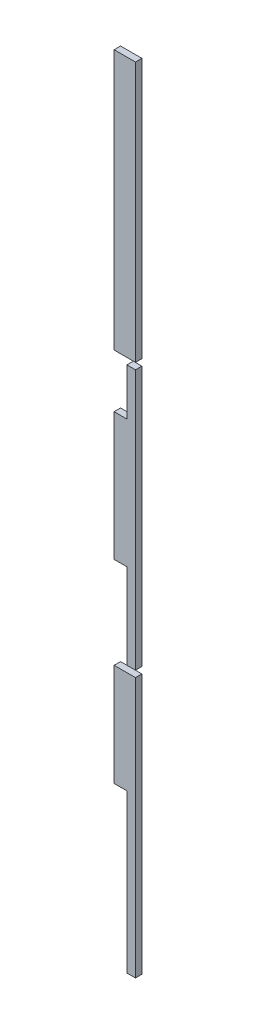
ISO-10303-21;
HEADER;
FILE_DESCRIPTION(('STEP AP214'),'2;1');
FILE_NAME('part.step','',(''),(''),'','','');
FILE_SCHEMA(('AUTOMOTIVE_DESIGN { 1 0 10303 214 1 1 1 1 }'));
ENDSEC;
DATA;
#1=APPLICATION_CONTEXT('core data for automotive mechanical design processes');
#2=APPLICATION_PROTOCOL_DEFINITION('international standard','automotive_design',2000,#1);
#3=PRODUCT_CONTEXT('',#1,'mechanical');
#4=PRODUCT('Part','Part','',(#3));
#5=PRODUCT_RELATED_PRODUCT_CATEGORY('part','',(#4));
#6=PRODUCT_DEFINITION_FORMATION('','',#4);
#7=PRODUCT_DEFINITION_CONTEXT('part definition',#1,'design');
#8=PRODUCT_DEFINITION('design','',#6,#7);
#9=PRODUCT_DEFINITION_SHAPE('','',#8);
#10=(LENGTH_UNIT() NAMED_UNIT(*) SI_UNIT(.MILLI.,.METRE.));
#11=(NAMED_UNIT(*) PLANE_ANGLE_UNIT() SI_UNIT($,.RADIAN.));
#12=(NAMED_UNIT(*) SI_UNIT($,.STERADIAN.) SOLID_ANGLE_UNIT());
#13=UNCERTAINTY_MEASURE_WITH_UNIT(LENGTH_MEASURE(1.E-05),#10,'distance_accuracy_value','');
#14=(GEOMETRIC_REPRESENTATION_CONTEXT(3) GLOBAL_UNCERTAINTY_ASSIGNED_CONTEXT((#13)) GLOBAL_UNIT_ASSIGNED_CONTEXT((#10,
#11,#12)) REPRESENTATION_CONTEXT('',''));
#15=CARTESIAN_POINT('',(0.,0.,0.));
#16=DIRECTION('',(0.,0.,1.));
#17=DIRECTION('',(1.,0.,0.));
#18=AXIS2_PLACEMENT_3D('',#15,#16,#17);
#19=CARTESIAN_POINT('',(126.787596037725,-1066.01,3.));
#20=DIRECTION('',(1.,0.,0.));
#21=DIRECTION('',(0.,0.,-1.));
#22=AXIS2_PLACEMENT_3D('',#19,#20,#21);
#23=PLANE('',#22);
#24=DIRECTION('',(0.,-1.,0.));
#25=VECTOR('',#24,1.);
#26=CARTESIAN_POINT('',(126.787596037725,-1066.01,0.));
#27=LINE('',#26,#25);
#28=CARTESIAN_POINT('',(126.787596037725,-1066.01,0.));
#29=VERTEX_POINT('',#28);
#30=CARTESIAN_POINT('',(126.787596037725,-1140.01,0.));
#31=VERTEX_POINT('',#30);
#32=EDGE_CURVE('E12',#29,#31,#27,.T.);
#33=ORIENTED_EDGE('',*,*,#32,.T.);
#34=DIRECTION('',(0.,0.,-1.));
#35=VECTOR('',#34,1.);
#36=CARTESIAN_POINT('',(126.787596037725,-1140.01,3.));
#37=LINE('',#36,#35);
#38=CARTESIAN_POINT('',(126.787596037725,-1140.01,3.));
#39=VERTEX_POINT('',#38);
#40=EDGE_CURVE('E154',#39,#31,#37,.T.);
#41=ORIENTED_EDGE('',*,*,#40,.F.);
#42=DIRECTION('',(0.,-1.,0.));
#43=VECTOR('',#42,1.);
#44=CARTESIAN_POINT('',(126.787596037725,-1066.01,3.));
#45=LINE('',#44,#43);
#46=CARTESIAN_POINT('',(126.787596037725,-1066.01,3.));
#47=VERTEX_POINT('',#46);
#48=EDGE_CURVE('E56',#47,#39,#45,.T.);
#49=ORIENTED_EDGE('',*,*,#48,.F.);
#50=DIRECTION('',(0.,0.,-1.));
#51=VECTOR('',#50,1.);
#52=CARTESIAN_POINT('',(126.787596037725,-1066.01,3.));
#53=LINE('',#52,#51);
#54=EDGE_CURVE('E142',#47,#29,#53,.T.);
#55=ORIENTED_EDGE('',*,*,#54,.T.);
#56=EDGE_LOOP('',(#33,#41,#49,#55));
#57=FACE_BOUND('',#56,.T.);
#58=ADVANCED_FACE('F52',(#57),#23,.F.);
#59=CARTESIAN_POINT('',(130.787596037725,-1140.01,3.));
#60=DIRECTION('',(0.,1.,0.));
#61=DIRECTION('',(0.,0.,1.));
#62=AXIS2_PLACEMENT_3D('',#59,#60,#61);
#63=PLANE('',#62);
#64=DIRECTION('',(1.,0.,0.));
#65=VECTOR('',#64,1.);
#66=CARTESIAN_POINT('',(130.787596037725,-1140.01,0.));
#67=LINE('',#66,#65);
#68=CARTESIAN_POINT('',(130.787596037725,-1140.01,0.));
#69=VERTEX_POINT('',#68);
#70=EDGE_CURVE('E62',#31,#69,#67,.T.);
#71=ORIENTED_EDGE('',*,*,#70,.T.);
#72=DIRECTION('',(0.,0.,-1.));
#73=VECTOR('',#72,1.);
#74=CARTESIAN_POINT('',(130.787596037725,-1140.01,3.));
#75=LINE('',#74,#73);
#76=CARTESIAN_POINT('',(130.787596037725,-1140.01,3.));
#77=VERTEX_POINT('',#76);
#78=EDGE_CURVE('E120',#77,#69,#75,.T.);
#79=ORIENTED_EDGE('',*,*,#78,.F.);
#80=DIRECTION('',(1.,0.,0.));
#81=VECTOR('',#80,1.);
#82=CARTESIAN_POINT('',(130.787596037725,-1140.01,3.));
#83=LINE('',#82,#81);
#84=EDGE_CURVE('E92',#39,#77,#83,.T.);
#85=ORIENTED_EDGE('',*,*,#84,.F.);
#86=ORIENTED_EDGE('',*,*,#40,.T.);
#87=EDGE_LOOP('',(#71,#79,#85,#86));
#88=FACE_BOUND('',#87,.T.);
#89=ADVANCED_FACE('F155',(#88),#63,.F.);
#90=CARTESIAN_POINT('',(130.787596037725,-1018.01,3.));
#91=DIRECTION('',(-1.,0.,0.));
#92=DIRECTION('',(0.,0.,1.));
#93=AXIS2_PLACEMENT_3D('',#90,#91,#92);
#94=PLANE('',#93);
#95=DIRECTION('',(0.,1.,0.));
#96=VECTOR('',#95,1.);
#97=CARTESIAN_POINT('',(130.787596037725,-1018.01,0.));
#98=LINE('',#97,#96);
#99=CARTESIAN_POINT('',(130.787596037725,-1018.01,0.));
#100=VERTEX_POINT('',#99);
#101=EDGE_CURVE('E114',#69,#100,#98,.T.);
#102=ORIENTED_EDGE('',*,*,#101,.T.);
#103=DIRECTION('',(0.,0.,-1.));
#104=VECTOR('',#103,1.);
#105=CARTESIAN_POINT('',(130.787596037725,-1018.01,3.));
#106=LINE('',#105,#104);
#107=CARTESIAN_POINT('',(130.787596037725,-1018.01,3.));
#108=VERTEX_POINT('',#107);
#109=EDGE_CURVE('E118',#108,#100,#106,.T.);
#110=ORIENTED_EDGE('',*,*,#109,.F.);
#111=DIRECTION('',(0.,1.,0.));
#112=VECTOR('',#111,1.);
#113=CARTESIAN_POINT('',(130.787596037725,-1076.01,3.));
#114=LINE('',#113,#112);
#115=EDGE_CURVE('E145',#77,#108,#114,.T.);
#116=ORIENTED_EDGE('',*,*,#115,.F.);
#117=ORIENTED_EDGE('',*,*,#78,.T.);
#118=EDGE_LOOP('',(#102,#110,#116,#117));
#119=FACE_BOUND('',#118,.T.);
#120=ADVANCED_FACE('F116',(#119),#94,.F.);
#121=CARTESIAN_POINT('',(120.787596037725,-1018.01,3.));
#122=DIRECTION('',(0.,-1.,0.));
#123=DIRECTION('',(0.,0.,-1.));
#124=AXIS2_PLACEMENT_3D('',#121,#122,#123);
#125=PLANE('',#124);
#126=DIRECTION('',(-1.,0.,0.));
#127=VECTOR('',#126,1.);
#128=CARTESIAN_POINT('',(120.787596037725,-1018.01,0.));
#129=LINE('',#128,#127);
#130=CARTESIAN_POINT('',(120.787596037725,-1018.01,0.));
#131=VERTEX_POINT('',#130);
#132=EDGE_CURVE('E122',#100,#131,#129,.T.);
#133=ORIENTED_EDGE('',*,*,#132,.T.);
#134=DIRECTION('',(0.,0.,-1.));
#135=VECTOR('',#134,1.);
#136=CARTESIAN_POINT('',(120.787596037725,-1018.01,3.));
#137=LINE('',#136,#135);
#138=CARTESIAN_POINT('',(120.787596037725,-1018.01,3.));
#139=VERTEX_POINT('',#138);
#140=EDGE_CURVE('E129',#139,#131,#137,.T.);
#141=ORIENTED_EDGE('',*,*,#140,.F.);
#142=DIRECTION('',(-1.,0.,0.));
#143=VECTOR('',#142,1.);
#144=CARTESIAN_POINT('',(120.787596037725,-1018.01,3.));
#145=LINE('',#144,#143);
#146=EDGE_CURVE('E128',#108,#139,#145,.T.);
#147=ORIENTED_EDGE('',*,*,#146,.F.);
#148=ORIENTED_EDGE('',*,*,#109,.T.);
#149=EDGE_LOOP('',(#133,#141,#147,#148));
#150=FACE_BOUND('',#149,.T.);
#151=ADVANCED_FACE('F125',(#150),#125,.F.);
#152=CARTESIAN_POINT('',(120.787596037725,-1018.01,3.));
#153=DIRECTION('',(1.,0.,0.));
#154=DIRECTION('',(0.,1.,0.));
#155=AXIS2_PLACEMENT_3D('',#152,#153,#154);
#156=PLANE('',#155);
#157=DIRECTION('',(0.,-1.,0.));
#158=VECTOR('',#157,1.);
#159=CARTESIAN_POINT('',(120.787596037725,-1018.01,0.));
#160=LINE('',#159,#158);
#161=CARTESIAN_POINT('',(120.787596037725,-1066.01,0.));
#162=VERTEX_POINT('',#161);
#163=EDGE_CURVE('E133',#131,#162,#160,.T.);
#164=ORIENTED_EDGE('',*,*,#163,.T.);
#165=DIRECTION('',(0.,0.,-1.));
#166=VECTOR('',#165,1.);
#167=CARTESIAN_POINT('',(120.787596037725,-1066.01,3.));
#168=LINE('',#167,#166);
#169=CARTESIAN_POINT('',(120.787596037725,-1066.01,3.));
#170=VERTEX_POINT('',#169);
#171=EDGE_CURVE('E150',#170,#162,#168,.T.);
#172=ORIENTED_EDGE('',*,*,#171,.F.);
#173=DIRECTION('',(0.,-1.,0.));
#174=VECTOR('',#173,1.);
#175=CARTESIAN_POINT('',(120.787596037725,-1018.01,3.));
#176=LINE('',#175,#174);
#177=EDGE_CURVE('E141',#139,#170,#176,.T.);
#178=ORIENTED_EDGE('',*,*,#177,.F.);
#179=ORIENTED_EDGE('',*,*,#140,.T.);
#180=EDGE_LOOP('',(#164,#172,#178,#179));
#181=FACE_BOUND('',#180,.T.);
#182=ADVANCED_FACE('F162',(#181),#156,.F.);
#183=CARTESIAN_POINT('',(120.787596037725,-1066.01,3.));
#184=DIRECTION('',(0.,1.,0.));
#185=DIRECTION('',(0.,0.,1.));
#186=AXIS2_PLACEMENT_3D('',#183,#184,#185);
#187=PLANE('',#186);
#188=DIRECTION('',(1.,0.,0.));
#189=VECTOR('',#188,1.);
#190=CARTESIAN_POINT('',(120.787596037725,-1066.01,0.));
#191=LINE('',#190,#189);
#192=EDGE_CURVE('E103',#162,#29,#191,.T.);
#193=ORIENTED_EDGE('',*,*,#192,.T.);
#194=ORIENTED_EDGE('',*,*,#54,.F.);
#195=DIRECTION('',(1.,0.,0.));
#196=VECTOR('',#195,1.);
#197=CARTESIAN_POINT('',(120.787596037725,-1066.01,3.));
#198=LINE('',#197,#196);
#199=EDGE_CURVE('E139',#170,#47,#198,.T.);
#200=ORIENTED_EDGE('',*,*,#199,.F.);
#201=ORIENTED_EDGE('',*,*,#171,.T.);
#202=EDGE_LOOP('',(#193,#194,#200,#201));
#203=FACE_BOUND('',#202,.T.);
#204=ADVANCED_FACE('F158',(#203),#187,.F.);
#205=CARTESIAN_POINT('',(0.,0.,3.));
#206=DIRECTION('',(0.,0.,-1.));
#207=DIRECTION('',(-1.,0.,0.));
#208=AXIS2_PLACEMENT_3D('',#205,#206,#207);
#209=PLANE('',#208);
#210=ORIENTED_EDGE('',*,*,#48,.T.);
#211=ORIENTED_EDGE('',*,*,#84,.T.);
#212=ORIENTED_EDGE('',*,*,#115,.T.);
#213=ORIENTED_EDGE('',*,*,#146,.T.);
#214=ORIENTED_EDGE('',*,*,#177,.T.);
#215=ORIENTED_EDGE('',*,*,#199,.T.);
#216=EDGE_LOOP('',(#210,#211,#212,#213,#214,#215));
#217=FACE_BOUND('',#216,.T.);
#218=ADVANCED_FACE('F54',(#217),#209,.F.);
#219=CARTESIAN_POINT('',(0.,0.,0.));
#220=DIRECTION('',(0.,0.,-1.));
#221=DIRECTION('',(-1.,0.,0.));
#222=AXIS2_PLACEMENT_3D('',#219,#220,#221);
#223=PLANE('',#222);
#224=ORIENTED_EDGE('',*,*,#32,.F.);
#225=ORIENTED_EDGE('',*,*,#192,.F.);
#226=ORIENTED_EDGE('',*,*,#163,.F.);
#227=ORIENTED_EDGE('',*,*,#132,.F.);
#228=ORIENTED_EDGE('',*,*,#101,.F.);
#229=ORIENTED_EDGE('',*,*,#70,.F.);
#230=EDGE_LOOP('',(#224,#225,#226,#227,#228,#229));
#231=FACE_BOUND('',#230,.T.);
#232=ADVANCED_FACE('F132',(#231),#223,.T.);
#233=CLOSED_SHELL('',(#58,#89,#120,#151,#182,#204,#218,#232));
#234=MANIFOLD_SOLID_BREP('B2',#233);
#235=CARTESIAN_POINT('',(120.787596037725,-975.01,3.));
#236=DIRECTION('',(1.,0.,0.));
#237=DIRECTION('',(0.,0.,-1.));
#238=AXIS2_PLACEMENT_3D('',#235,#236,#237);
#239=PLANE('',#238);
#240=DIRECTION('',(0.,-1.,0.));
#241=VECTOR('',#240,1.);
#242=CARTESIAN_POINT('',(120.787596037725,-975.01,0.));
#243=LINE('',#242,#241);
#244=CARTESIAN_POINT('',(120.787596037725,-915.01,0.));
#245=VERTEX_POINT('',#244);
#246=CARTESIAN_POINT('',(120.787596037725,-975.01,0.));
#247=VERTEX_POINT('',#246);
#248=EDGE_CURVE('E50',#245,#247,#243,.T.);
#249=ORIENTED_EDGE('',*,*,#248,.T.);
#250=DIRECTION('',(0.,0.,-1.));
#251=VECTOR('',#250,1.);
#252=CARTESIAN_POINT('',(120.787596037725,-975.01,3.));
#253=LINE('',#252,#251);
#254=CARTESIAN_POINT('',(120.787596037725,-975.01,3.));
#255=VERTEX_POINT('',#254);
#256=EDGE_CURVE('E376',#255,#247,#253,.T.);
#257=ORIENTED_EDGE('',*,*,#256,.F.);
#258=DIRECTION('',(0.,-1.,0.));
#259=VECTOR('',#258,1.);
#260=CARTESIAN_POINT('',(120.787596037725,-975.01,3.));
#261=LINE('',#260,#259);
#262=CARTESIAN_POINT('',(120.787596037725,-915.01,3.));
#263=VERTEX_POINT('',#262);
#264=EDGE_CURVE('E244',#263,#255,#261,.T.);
#265=ORIENTED_EDGE('',*,*,#264,.F.);
#266=DIRECTION('',(0.,0.,-1.));
#267=VECTOR('',#266,1.);
#268=CARTESIAN_POINT('',(120.787596037725,-915.01,3.));
#269=LINE('',#268,#267);
#270=EDGE_CURVE('E344',#263,#245,#269,.T.);
#271=ORIENTED_EDGE('',*,*,#270,.T.);
#272=EDGE_LOOP('',(#249,#257,#265,#271));
#273=FACE_BOUND('',#272,.T.);
#274=ADVANCED_FACE('F240',(#273),#239,.F.);
#275=CARTESIAN_POINT('',(120.787596037725,-975.01,3.));
#276=DIRECTION('',(0.,1.,0.));
#277=DIRECTION('',(0.,0.,1.));
#278=AXIS2_PLACEMENT_3D('',#275,#276,#277);
#279=PLANE('',#278);
#280=DIRECTION('',(1.,0.,0.));
#281=VECTOR('',#280,1.);
#282=CARTESIAN_POINT('',(120.787596037725,-975.01,0.));
#283=LINE('',#282,#281);
#284=CARTESIAN_POINT('',(126.787596037725,-975.01,0.));
#285=VERTEX_POINT('',#284);
#286=EDGE_CURVE('E250',#247,#285,#283,.T.);
#287=ORIENTED_EDGE('',*,*,#286,.T.);
#288=DIRECTION('',(0.,0.,-1.));
#289=VECTOR('',#288,1.);
#290=CARTESIAN_POINT('',(126.787596037725,-975.01,3.));
#291=LINE('',#290,#289);
#292=CARTESIAN_POINT('',(126.787596037725,-975.01,3.));
#293=VERTEX_POINT('',#292);
#294=EDGE_CURVE('E320',#293,#285,#291,.T.);
#295=ORIENTED_EDGE('',*,*,#294,.F.);
#296=DIRECTION('',(1.,0.,0.));
#297=VECTOR('',#296,1.);
#298=CARTESIAN_POINT('',(120.787596037725,-975.01,3.));
#299=LINE('',#298,#297);
#300=EDGE_CURVE('E286',#255,#293,#299,.T.);
#301=ORIENTED_EDGE('',*,*,#300,.F.);
#302=ORIENTED_EDGE('',*,*,#256,.T.);
#303=EDGE_LOOP('',(#287,#295,#301,#302));
#304=FACE_BOUND('',#303,.T.);
#305=ADVANCED_FACE('F382',(#304),#279,.F.);
#306=CARTESIAN_POINT('',(126.787596037725,-975.01,3.));
#307=DIRECTION('',(1.,0.,0.));
#308=DIRECTION('',(0.,1.,0.));
#309=AXIS2_PLACEMENT_3D('',#306,#307,#308);
#310=PLANE('',#309);
#311=DIRECTION('',(0.,-1.,0.));
#312=VECTOR('',#311,1.);
#313=CARTESIAN_POINT('',(126.787596037725,-975.01,0.));
#314=LINE('',#313,#312);
#315=CARTESIAN_POINT('',(126.787596037725,-1015.01,0.));
#316=VERTEX_POINT('',#315);
#317=EDGE_CURVE('E314',#285,#316,#314,.T.);
#318=ORIENTED_EDGE('',*,*,#317,.T.);
#319=DIRECTION('',(0.,0.,-1.));
#320=VECTOR('',#319,1.);
#321=CARTESIAN_POINT('',(126.787596037725,-1015.01,3.));
#322=LINE('',#321,#320);
#323=CARTESIAN_POINT('',(126.787596037725,-1015.01,3.));
#324=VERTEX_POINT('',#323);
#325=EDGE_CURVE('E318',#324,#316,#322,.T.);
#326=ORIENTED_EDGE('',*,*,#325,.F.);
#327=DIRECTION('',(0.,-1.,0.));
#328=VECTOR('',#327,1.);
#329=CARTESIAN_POINT('',(126.787596037725,-975.01,3.));
#330=LINE('',#329,#328);
#331=EDGE_CURVE('E351',#293,#324,#330,.T.);
#332=ORIENTED_EDGE('',*,*,#331,.F.);
#333=ORIENTED_EDGE('',*,*,#294,.T.);
#334=EDGE_LOOP('',(#318,#326,#332,#333));
#335=FACE_BOUND('',#334,.T.);
#336=ADVANCED_FACE('F316',(#335),#310,.F.);
#337=CARTESIAN_POINT('',(130.787596037725,-1015.01,3.));
#338=DIRECTION('',(0.,1.,0.));
#339=DIRECTION('',(0.,0.,1.));
#340=AXIS2_PLACEMENT_3D('',#337,#338,#339);
#341=PLANE('',#340);
#342=DIRECTION('',(1.,0.,0.));
#343=VECTOR('',#342,1.);
#344=CARTESIAN_POINT('',(130.787596037725,-1015.01,0.));
#345=LINE('',#344,#343);
#346=CARTESIAN_POINT('',(130.787596037725,-1015.01,0.));
#347=VERTEX_POINT('',#346);
#348=EDGE_CURVE('E322',#316,#347,#345,.T.);
#349=ORIENTED_EDGE('',*,*,#348,.T.);
#350=DIRECTION('',(0.,0.,-1.));
#351=VECTOR('',#350,1.);
#352=CARTESIAN_POINT('',(130.787596037725,-1015.01,3.));
#353=LINE('',#352,#351);
#354=CARTESIAN_POINT('',(130.787596037725,-1015.01,3.));
#355=VERTEX_POINT('',#354);
#356=EDGE_CURVE('E330',#355,#347,#353,.T.);
#357=ORIENTED_EDGE('',*,*,#356,.F.);
#358=DIRECTION('',(1.,0.,0.));
#359=VECTOR('',#358,1.);
#360=CARTESIAN_POINT('',(130.787596037725,-1015.01,3.));
#361=LINE('',#360,#359);
#362=EDGE_CURVE('E329',#324,#355,#361,.T.);
#363=ORIENTED_EDGE('',*,*,#362,.F.);
#364=ORIENTED_EDGE('',*,*,#325,.T.);
#365=EDGE_LOOP('',(#349,#357,#363,#364));
#366=FACE_BOUND('',#365,.T.);
#367=ADVANCED_FACE('F326',(#366),#341,.F.);
#368=CARTESIAN_POINT('',(130.787596037725,-893.01,3.));
#369=DIRECTION('',(-1.,0.,0.));
#370=DIRECTION('',(0.,0.,1.));
#371=AXIS2_PLACEMENT_3D('',#368,#369,#370);
#372=PLANE('',#371);
#373=DIRECTION('',(0.,1.,0.));
#374=VECTOR('',#373,1.);
#375=CARTESIAN_POINT('',(130.787596037725,-893.01,0.));
#376=LINE('',#375,#374);
#377=CARTESIAN_POINT('',(130.787596037725,-893.01,0.));
#378=VERTEX_POINT('',#377);
#379=EDGE_CURVE('E334',#347,#378,#376,.T.);
#380=ORIENTED_EDGE('',*,*,#379,.T.);
#381=DIRECTION('',(0.,0.,-1.));
#382=VECTOR('',#381,1.);
#383=CARTESIAN_POINT('',(130.787596037725,-893.01,3.));
#384=LINE('',#383,#382);
#385=CARTESIAN_POINT('',(130.787596037725,-893.01,3.));
#386=VERTEX_POINT('',#385);
#387=EDGE_CURVE('E368',#386,#378,#384,.T.);
#388=ORIENTED_EDGE('',*,*,#387,.F.);
#389=DIRECTION('',(0.,1.,0.));
#390=VECTOR('',#389,1.);
#391=CARTESIAN_POINT('',(130.787596037725,-985.01,3.));
#392=LINE('',#391,#390);
#393=EDGE_CURVE('E348',#355,#386,#392,.T.);
#394=ORIENTED_EDGE('',*,*,#393,.F.);
#395=ORIENTED_EDGE('',*,*,#356,.T.);
#396=EDGE_LOOP('',(#380,#388,#394,#395));
#397=FACE_BOUND('',#396,.T.);
#398=ADVANCED_FACE('F385',(#397),#372,.F.);
#399=CARTESIAN_POINT('',(130.787596037725,-893.01,3.));
#400=DIRECTION('',(0.,-1.,0.));
#401=DIRECTION('',(0.,0.,-1.));
#402=AXIS2_PLACEMENT_3D('',#399,#400,#401);
#403=PLANE('',#402);
#404=DIRECTION('',(-1.,0.,0.));
#405=VECTOR('',#404,1.);
#406=CARTESIAN_POINT('',(130.787596037725,-893.01,0.));
#407=LINE('',#406,#405);
#408=CARTESIAN_POINT('',(126.787596037725,-893.01,0.));
#409=VERTEX_POINT('',#408);
#410=EDGE_CURVE('E336',#378,#409,#407,.T.);
#411=ORIENTED_EDGE('',*,*,#410,.T.);
#412=DIRECTION('',(0.,0.,-1.));
#413=VECTOR('',#412,1.);
#414=CARTESIAN_POINT('',(126.787596037725,-893.01,3.));
#415=LINE('',#414,#413);
#416=CARTESIAN_POINT('',(126.787596037725,-893.01,3.));
#417=VERTEX_POINT('',#416);
#418=EDGE_CURVE('E365',#417,#409,#415,.T.);
#419=ORIENTED_EDGE('',*,*,#418,.F.);
#420=DIRECTION('',(-1.,0.,0.));
#421=VECTOR('',#420,1.);
#422=CARTESIAN_POINT('',(130.787596037725,-893.01,3.));
#423=LINE('',#422,#421);
#424=EDGE_CURVE('E346',#386,#417,#423,.T.);
#425=ORIENTED_EDGE('',*,*,#424,.F.);
#426=ORIENTED_EDGE('',*,*,#387,.T.);
#427=EDGE_LOOP('',(#411,#419,#425,#426));
#428=FACE_BOUND('',#427,.T.);
#429=ADVANCED_FACE('F363',(#428),#403,.F.);
#430=CARTESIAN_POINT('',(126.787596037725,-893.01,3.));
#431=DIRECTION('',(1.,0.,0.));
#432=DIRECTION('',(0.,0.,-1.));
#433=AXIS2_PLACEMENT_3D('',#430,#431,#432);
#434=PLANE('',#433);
#435=DIRECTION('',(0.,-1.,0.));
#436=VECTOR('',#435,1.);
#437=CARTESIAN_POINT('',(126.787596037725,-893.01,0.));
#438=LINE('',#437,#436);
#439=CARTESIAN_POINT('',(126.787596037725,-915.01,0.));
#440=VERTEX_POINT('',#439);
#441=EDGE_CURVE('E354',#409,#440,#438,.T.);
#442=ORIENTED_EDGE('',*,*,#441,.T.);
#443=DIRECTION('',(0.,0.,-1.));
#444=VECTOR('',#443,1.);
#445=CARTESIAN_POINT('',(126.787596037725,-915.01,3.));
#446=LINE('',#445,#444);
#447=CARTESIAN_POINT('',(126.787596037725,-915.01,3.));
#448=VERTEX_POINT('',#447);
#449=EDGE_CURVE('E373',#448,#440,#446,.T.);
#450=ORIENTED_EDGE('',*,*,#449,.F.);
#451=DIRECTION('',(0.,-1.,0.));
#452=VECTOR('',#451,1.);
#453=CARTESIAN_POINT('',(126.787596037725,-893.01,3.));
#454=LINE('',#453,#452);
#455=EDGE_CURVE('E343',#417,#448,#454,.T.);
#456=ORIENTED_EDGE('',*,*,#455,.F.);
#457=ORIENTED_EDGE('',*,*,#418,.T.);
#458=EDGE_LOOP('',(#442,#450,#456,#457));
#459=FACE_BOUND('',#458,.T.);
#460=ADVANCED_FACE('F371',(#459),#434,.F.);
#461=CARTESIAN_POINT('',(120.787596037725,-915.01,3.));
#462=DIRECTION('',(0.,-1.,0.));
#463=DIRECTION('',(0.,0.,-1.));
#464=AXIS2_PLACEMENT_3D('',#461,#462,#463);
#465=PLANE('',#464);
#466=DIRECTION('',(-1.,0.,0.));
#467=VECTOR('',#466,1.);
#468=CARTESIAN_POINT('',(120.787596037725,-915.01,0.));
#469=LINE('',#468,#467);
#470=EDGE_CURVE('E297',#440,#245,#469,.T.);
#471=ORIENTED_EDGE('',*,*,#470,.T.);
#472=ORIENTED_EDGE('',*,*,#270,.F.);
#473=DIRECTION('',(-1.,0.,0.));
#474=VECTOR('',#473,1.);
#475=CARTESIAN_POINT('',(120.787596037725,-915.01,3.));
#476=LINE('',#475,#474);
#477=EDGE_CURVE('E341',#448,#263,#476,.T.);
#478=ORIENTED_EDGE('',*,*,#477,.F.);
#479=ORIENTED_EDGE('',*,*,#449,.T.);
#480=EDGE_LOOP('',(#471,#472,#478,#479));
#481=FACE_BOUND('',#480,.T.);
#482=ADVANCED_FACE('F386',(#481),#465,.F.);
#483=CARTESIAN_POINT('',(0.,0.,3.));
#484=DIRECTION('',(0.,0.,-1.));
#485=DIRECTION('',(-1.,0.,0.));
#486=AXIS2_PLACEMENT_3D('',#483,#484,#485);
#487=PLANE('',#486);
#488=ORIENTED_EDGE('',*,*,#264,.T.);
#489=ORIENTED_EDGE('',*,*,#300,.T.);
#490=ORIENTED_EDGE('',*,*,#331,.T.);
#491=ORIENTED_EDGE('',*,*,#362,.T.);
#492=ORIENTED_EDGE('',*,*,#393,.T.);
#493=ORIENTED_EDGE('',*,*,#424,.T.);
#494=ORIENTED_EDGE('',*,*,#455,.T.);
#495=ORIENTED_EDGE('',*,*,#477,.T.);
#496=EDGE_LOOP('',(#488,#489,#490,#491,#492,#493,#494,#495));
#497=FACE_BOUND('',#496,.T.);
#498=ADVANCED_FACE('F242',(#497),#487,.F.);
#499=CARTESIAN_POINT('',(0.,0.,0.));
#500=DIRECTION('',(0.,0.,-1.));
#501=DIRECTION('',(-1.,0.,0.));
#502=AXIS2_PLACEMENT_3D('',#499,#500,#501);
#503=PLANE('',#502);
#504=ORIENTED_EDGE('',*,*,#248,.F.);
#505=ORIENTED_EDGE('',*,*,#470,.F.);
#506=ORIENTED_EDGE('',*,*,#441,.F.);
#507=ORIENTED_EDGE('',*,*,#410,.F.);
#508=ORIENTED_EDGE('',*,*,#379,.F.);
#509=ORIENTED_EDGE('',*,*,#348,.F.);
#510=ORIENTED_EDGE('',*,*,#317,.F.);
#511=ORIENTED_EDGE('',*,*,#286,.F.);
#512=EDGE_LOOP('',(#504,#505,#506,#507,#508,#509,#510,#511));
#513=FACE_BOUND('',#512,.T.);
#514=ADVANCED_FACE('F332',(#513),#503,.T.);
#515=CLOSED_SHELL('',(#274,#305,#336,#367,#398,#429,#460,#482,#498,#514));
#516=MANIFOLD_SOLID_BREP('B6',#515);
#517=CARTESIAN_POINT('',(120.787596037725,-768.01,3.));
#518=DIRECTION('',(1.,0.,0.));
#519=DIRECTION('',(0.,1.,0.));
#520=AXIS2_PLACEMENT_3D('',#517,#518,#519);
#521=PLANE('',#520);
#522=DIRECTION('',(0.,-1.,0.));
#523=VECTOR('',#522,1.);
#524=CARTESIAN_POINT('',(120.787596037725,-768.01,0.));
#525=LINE('',#524,#523);
#526=CARTESIAN_POINT('',(120.787596037725,-768.01,0.));
#527=VERTEX_POINT('',#526);
#528=CARTESIAN_POINT('',(120.787596037725,-890.01,0.));
#529=VERTEX_POINT('',#528);
#530=EDGE_CURVE('E537',#527,#529,#525,.T.);
#531=ORIENTED_EDGE('',*,*,#530,.T.);
#532=DIRECTION('',(0.,0.,-1.));
#533=VECTOR('',#532,1.);
#534=CARTESIAN_POINT('',(120.787596037725,-890.01,3.));
#535=LINE('',#534,#533);
#536=CARTESIAN_POINT('',(120.787596037725,-890.01,3.));
#537=VERTEX_POINT('',#536);
#538=EDGE_CURVE('E238',#537,#529,#535,.T.);
#539=ORIENTED_EDGE('',*,*,#538,.F.);
#540=DIRECTION('',(0.,-1.,0.));
#541=VECTOR('',#540,1.);
#542=CARTESIAN_POINT('',(120.787596037725,-768.01,3.));
#543=LINE('',#542,#541);
#544=CARTESIAN_POINT('',(120.787596037725,-768.01,3.));
#545=VERTEX_POINT('',#544);
#546=EDGE_CURVE('E525',#545,#537,#543,.T.);
#547=ORIENTED_EDGE('',*,*,#546,.F.);
#548=DIRECTION('',(0.,0.,-1.));
#549=VECTOR('',#548,1.);
#550=CARTESIAN_POINT('',(120.787596037725,-768.01,3.));
#551=LINE('',#550,#549);
#552=EDGE_CURVE('E533',#545,#527,#551,.T.);
#553=ORIENTED_EDGE('',*,*,#552,.T.);
#554=EDGE_LOOP('',(#531,#539,#547,#553));
#555=FACE_BOUND('',#554,.T.);
#556=ADVANCED_FACE('F474',(#555),#521,.F.);
#557=CARTESIAN_POINT('',(120.787596037725,-890.01,3.));
#558=DIRECTION('',(0.,1.,0.));
#559=DIRECTION('',(0.,0.,1.));
#560=AXIS2_PLACEMENT_3D('',#557,#558,#559);
#561=PLANE('',#560);
#562=DIRECTION('',(1.,0.,0.));
#563=VECTOR('',#562,1.);
#564=CARTESIAN_POINT('',(120.787596037725,-890.01,0.));
#565=LINE('',#564,#563);
#566=CARTESIAN_POINT('',(130.787596037725,-890.01,0.));
#567=VERTEX_POINT('',#566);
#568=EDGE_CURVE('E529',#529,#567,#565,.T.);
#569=ORIENTED_EDGE('',*,*,#568,.T.);
#570=DIRECTION('',(0.,0.,-1.));
#571=VECTOR('',#570,1.);
#572=CARTESIAN_POINT('',(130.787596037725,-890.01,3.));
#573=LINE('',#572,#571);
#574=CARTESIAN_POINT('',(130.787596037725,-890.01,3.));
#575=VERTEX_POINT('',#574);
#576=EDGE_CURVE('E482',#575,#567,#573,.T.);
#577=ORIENTED_EDGE('',*,*,#576,.F.);
#578=DIRECTION('',(1.,0.,0.));
#579=VECTOR('',#578,1.);
#580=CARTESIAN_POINT('',(120.787596037725,-890.01,3.));
#581=LINE('',#580,#579);
#582=EDGE_CURVE('E520',#537,#575,#581,.T.);
#583=ORIENTED_EDGE('',*,*,#582,.F.);
#584=ORIENTED_EDGE('',*,*,#538,.T.);
#585=EDGE_LOOP('',(#569,#577,#583,#584));
#586=FACE_BOUND('',#585,.T.);
#587=ADVANCED_FACE('F528',(#586),#561,.F.);
#588=CARTESIAN_POINT('',(130.787596037725,-768.01,3.));
#589=DIRECTION('',(-1.,0.,0.));
#590=DIRECTION('',(0.,-1.,0.));
#591=AXIS2_PLACEMENT_3D('',#588,#589,#590);
#592=PLANE('',#591);
#593=DIRECTION('',(0.,1.,0.));
#594=VECTOR('',#593,1.);
#595=CARTESIAN_POINT('',(130.787596037725,-768.01,0.));
#596=LINE('',#595,#594);
#597=CARTESIAN_POINT('',(130.787596037725,-768.01,0.));
#598=VERTEX_POINT('',#597);
#599=EDGE_CURVE('E507',#567,#598,#596,.T.);
#600=ORIENTED_EDGE('',*,*,#599,.T.);
#601=DIRECTION('',(0.,0.,-1.));
#602=VECTOR('',#601,1.);
#603=CARTESIAN_POINT('',(130.787596037725,-768.01,3.));
#604=LINE('',#603,#602);
#605=CARTESIAN_POINT('',(130.787596037725,-768.01,3.));
#606=VERTEX_POINT('',#605);
#607=EDGE_CURVE('E530',#606,#598,#604,.T.);
#608=ORIENTED_EDGE('',*,*,#607,.F.);
#609=DIRECTION('',(0.,1.,0.));
#610=VECTOR('',#609,1.);
#611=CARTESIAN_POINT('',(130.787596037725,-768.01,3.));
#612=LINE('',#611,#610);
#613=EDGE_CURVE('E523',#575,#606,#612,.T.);
#614=ORIENTED_EDGE('',*,*,#613,.F.);
#615=ORIENTED_EDGE('',*,*,#576,.T.);
#616=EDGE_LOOP('',(#600,#608,#614,#615));
#617=FACE_BOUND('',#616,.T.);
#618=ADVANCED_FACE('F531',(#617),#592,.F.);
#619=CARTESIAN_POINT('',(120.787596037725,-768.01,3.));
#620=DIRECTION('',(0.,-1.,0.));
#621=DIRECTION('',(0.,0.,-1.));
#622=AXIS2_PLACEMENT_3D('',#619,#620,#621);
#623=PLANE('',#622);
#624=DIRECTION('',(-1.,0.,0.));
#625=VECTOR('',#624,1.);
#626=CARTESIAN_POINT('',(120.787596037725,-768.01,0.));
#627=LINE('',#626,#625);
#628=EDGE_CURVE('E513',#598,#527,#627,.T.);
#629=ORIENTED_EDGE('',*,*,#628,.T.);
#630=ORIENTED_EDGE('',*,*,#552,.F.);
#631=DIRECTION('',(-1.,0.,0.));
#632=VECTOR('',#631,1.);
#633=CARTESIAN_POINT('',(120.787596037725,-768.01,3.));
#634=LINE('',#633,#632);
#635=EDGE_CURVE('E490',#606,#545,#634,.T.);
#636=ORIENTED_EDGE('',*,*,#635,.F.);
#637=ORIENTED_EDGE('',*,*,#607,.T.);
#638=EDGE_LOOP('',(#629,#630,#636,#637));
#639=FACE_BOUND('',#638,.T.);
#640=ADVANCED_FACE('F544',(#639),#623,.F.);
#641=CARTESIAN_POINT('',(0.,0.,3.));
#642=DIRECTION('',(0.,0.,1.));
#643=DIRECTION('',(1.,0.,0.));
#644=AXIS2_PLACEMENT_3D('',#641,#642,#643);
#645=PLANE('',#644);
#646=ORIENTED_EDGE('',*,*,#546,.T.);
#647=ORIENTED_EDGE('',*,*,#582,.T.);
#648=ORIENTED_EDGE('',*,*,#613,.T.);
#649=ORIENTED_EDGE('',*,*,#635,.T.);
#650=EDGE_LOOP('',(#646,#647,#648,#649));
#651=FACE_BOUND('',#650,.T.);
#652=ADVANCED_FACE('F521',(#651),#645,.T.);
#653=CARTESIAN_POINT('',(0.,0.,0.));
#654=DIRECTION('',(0.,0.,1.));
#655=DIRECTION('',(1.,0.,0.));
#656=AXIS2_PLACEMENT_3D('',#653,#654,#655);
#657=PLANE('',#656);
#658=ORIENTED_EDGE('',*,*,#530,.F.);
#659=ORIENTED_EDGE('',*,*,#628,.F.);
#660=ORIENTED_EDGE('',*,*,#599,.F.);
#661=ORIENTED_EDGE('',*,*,#568,.F.);
#662=EDGE_LOOP('',(#658,#659,#660,#661));
#663=FACE_BOUND('',#662,.T.);
#664=ADVANCED_FACE('F547',(#663),#657,.F.);
#665=CLOSED_SHELL('',(#556,#587,#618,#640,#652,#664));
#666=MANIFOLD_SOLID_BREP('B44',#665);
#667=ADVANCED_BREP_SHAPE_REPRESENTATION('',(#18,#234,#516,#666),#14);
#668=SHAPE_DEFINITION_REPRESENTATION(#9,#667);
ENDSEC;
END-ISO-10303-21;
